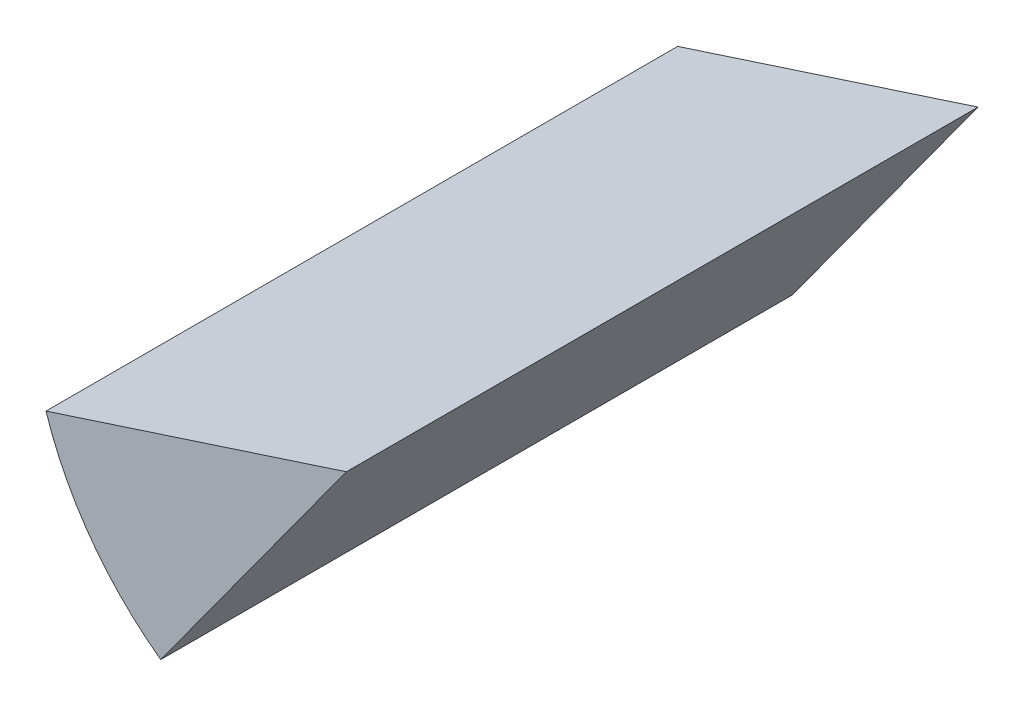
ISO-10303-21;
HEADER;
FILE_DESCRIPTION(('STEP AP214'),'2;1');
FILE_NAME('part.step','',(''),(''),'','','');
FILE_SCHEMA(('AUTOMOTIVE_DESIGN { 1 0 10303 214 1 1 1 1 }'));
ENDSEC;
DATA;
#1=APPLICATION_CONTEXT('core data for automotive mechanical design processes');
#2=APPLICATION_PROTOCOL_DEFINITION('international standard','automotive_design',2000,#1);
#3=PRODUCT_CONTEXT('',#1,'mechanical');
#4=PRODUCT('Part','Part','',(#3));
#5=PRODUCT_RELATED_PRODUCT_CATEGORY('part','',(#4));
#6=PRODUCT_DEFINITION_FORMATION('','',#4);
#7=PRODUCT_DEFINITION_CONTEXT('part definition',#1,'design');
#8=PRODUCT_DEFINITION('design','',#6,#7);
#9=PRODUCT_DEFINITION_SHAPE('','',#8);
#10=(LENGTH_UNIT() NAMED_UNIT(*) SI_UNIT(.MILLI.,.METRE.));
#11=(NAMED_UNIT(*) PLANE_ANGLE_UNIT() SI_UNIT($,.RADIAN.));
#12=(NAMED_UNIT(*) SI_UNIT($,.STERADIAN.) SOLID_ANGLE_UNIT());
#13=UNCERTAINTY_MEASURE_WITH_UNIT(LENGTH_MEASURE(1.E-05),#10,'distance_accuracy_value','');
#14=(GEOMETRIC_REPRESENTATION_CONTEXT(3) GLOBAL_UNCERTAINTY_ASSIGNED_CONTEXT((#13)) GLOBAL_UNIT_ASSIGNED_CONTEXT((#10,
#11,#12)) REPRESENTATION_CONTEXT('',''));
#15=CARTESIAN_POINT('',(0.,0.,0.));
#16=DIRECTION('',(0.,0.,1.));
#17=DIRECTION('',(1.,0.,0.));
#18=AXIS2_PLACEMENT_3D('',#15,#16,#17);
#19=CARTESIAN_POINT('',(0.,0.,50.));
#20=DIRECTION('',(-0.809016994374947,0.587785252292474,0.));
#21=DIRECTION('',(-0.587785252292474,-0.809016994374947,0.));
#22=AXIS2_PLACEMENT_3D('',#19,#20,#21);
#23=PLANE('',#22);
#24=DIRECTION('',(0.587785252292474,0.809016994374947,0.));
#25=VECTOR('',#24,1.);
#26=CARTESIAN_POINT('',(0.,0.,0.));
#27=LINE('',#26,#25);
#28=CARTESIAN_POINT('',(-14.6946313073119,-20.2254248593737,0.));
#29=VERTEX_POINT('',#28);
#30=CARTESIAN_POINT('',(0.,0.,0.));
#31=VERTEX_POINT('',#30);
#32=EDGE_CURVE('E80',#29,#31,#27,.T.);
#33=ORIENTED_EDGE('',*,*,#32,.T.);
#34=DIRECTION('',(0.,0.,-1.));
#35=VECTOR('',#34,1.);
#36=CARTESIAN_POINT('',(0.,0.,50.));
#37=LINE('',#36,#35);
#38=CARTESIAN_POINT('',(0.,0.,50.));
#39=VERTEX_POINT('',#38);
#40=EDGE_CURVE('E11',#39,#31,#37,.T.);
#41=ORIENTED_EDGE('',*,*,#40,.F.);
#42=DIRECTION('',(0.587785252292474,0.809016994374947,0.));
#43=VECTOR('',#42,1.);
#44=CARTESIAN_POINT('',(0.,0.,50.));
#45=LINE('',#44,#43);
#46=CARTESIAN_POINT('',(-14.6946313073119,-20.2254248593737,50.));
#47=VERTEX_POINT('',#46);
#48=EDGE_CURVE('E73',#47,#39,#45,.T.);
#49=ORIENTED_EDGE('',*,*,#48,.F.);
#50=DIRECTION('',(0.,0.,-1.));
#51=VECTOR('',#50,1.);
#52=CARTESIAN_POINT('',(-14.6946313073119,-20.2254248593737,50.));
#53=LINE('',#52,#51);
#54=EDGE_CURVE('E81',#47,#29,#53,.T.);
#55=ORIENTED_EDGE('',*,*,#54,.T.);
#56=EDGE_LOOP('',(#33,#41,#49,#55));
#57=FACE_BOUND('',#56,.T.);
#58=ADVANCED_FACE('F33',(#57),#23,.F.);
#59=CARTESIAN_POINT('',(0.,0.,50.));
#60=DIRECTION('',(0.309016994374945,-0.951056516295154,0.));
#61=DIRECTION('',(0.951056516295154,0.309016994374945,0.));
#62=AXIS2_PLACEMENT_3D('',#59,#60,#61);
#63=PLANE('',#62);
#64=DIRECTION('',(-0.951056516295154,-0.309016994374945,0.));
#65=VECTOR('',#64,1.);
#66=CARTESIAN_POINT('',(0.,0.,0.));
#67=LINE('',#66,#65);
#68=CARTESIAN_POINT('',(-23.7764129073789,-7.72542485937362,0.));
#69=VERTEX_POINT('',#68);
#70=EDGE_CURVE('E61',#31,#69,#67,.T.);
#71=ORIENTED_EDGE('',*,*,#70,.T.);
#72=DIRECTION('',(0.,0.,-1.));
#73=VECTOR('',#72,1.);
#74=CARTESIAN_POINT('',(-23.7764129073789,-7.72542485937362,50.));
#75=LINE('',#74,#73);
#76=CARTESIAN_POINT('',(-23.7764129073789,-7.72542485937362,50.));
#77=VERTEX_POINT('',#76);
#78=EDGE_CURVE('E41',#77,#69,#75,.T.);
#79=ORIENTED_EDGE('',*,*,#78,.F.);
#80=DIRECTION('',(-0.951056516295154,-0.309016994374945,0.));
#81=VECTOR('',#80,1.);
#82=CARTESIAN_POINT('',(0.,0.,50.));
#83=LINE('',#82,#81);
#84=EDGE_CURVE('E69',#39,#77,#83,.T.);
#85=ORIENTED_EDGE('',*,*,#84,.F.);
#86=ORIENTED_EDGE('',*,*,#40,.T.);
#87=EDGE_LOOP('',(#71,#79,#85,#86));
#88=FACE_BOUND('',#87,.T.);
#89=ADVANCED_FACE('F70',(#88),#63,.F.);
#90=CARTESIAN_POINT('',(0.,0.,50.));
#91=DIRECTION('',(0.,0.,-1.));
#92=DIRECTION('',(-1.,0.,0.));
#93=AXIS2_PLACEMENT_3D('',#90,#91,#92);
#94=CYLINDRICAL_SURFACE('',#93,25.);
#95=CARTESIAN_POINT('',(0.,0.,0.));
#96=DIRECTION('',(0.,0.,1.));
#97=DIRECTION('',(1.,0.,0.));
#98=AXIS2_PLACEMENT_3D('',#95,#96,#97);
#99=CIRCLE('',#98,25.);
#100=EDGE_CURVE('E66',#69,#29,#99,.T.);
#101=ORIENTED_EDGE('',*,*,#100,.T.);
#102=ORIENTED_EDGE('',*,*,#54,.F.);
#103=CARTESIAN_POINT('',(0.,0.,50.));
#104=DIRECTION('',(0.,0.,1.));
#105=DIRECTION('',(1.,0.,0.));
#106=AXIS2_PLACEMENT_3D('',#103,#104,#105);
#107=CIRCLE('',#106,25.);
#108=EDGE_CURVE('E49',#77,#47,#107,.T.);
#109=ORIENTED_EDGE('',*,*,#108,.F.);
#110=ORIENTED_EDGE('',*,*,#78,.T.);
#111=EDGE_LOOP('',(#101,#102,#109,#110));
#112=FACE_BOUND('',#111,.T.);
#113=ADVANCED_FACE('F92',(#112),#94,.T.);
#114=CARTESIAN_POINT('',(0.,0.,50.));
#115=DIRECTION('',(0.,0.,1.));
#116=DIRECTION('',(1.,0.,0.));
#117=AXIS2_PLACEMENT_3D('',#114,#115,#116);
#118=PLANE('',#117);
#119=ORIENTED_EDGE('',*,*,#48,.T.);
#120=ORIENTED_EDGE('',*,*,#84,.T.);
#121=ORIENTED_EDGE('',*,*,#108,.T.);
#122=EDGE_LOOP('',(#119,#120,#121));
#123=FACE_BOUND('',#122,.T.);
#124=ADVANCED_FACE('F76',(#123),#118,.T.);
#125=CARTESIAN_POINT('',(0.,0.,0.));
#126=DIRECTION('',(0.,0.,1.));
#127=DIRECTION('',(1.,0.,0.));
#128=AXIS2_PLACEMENT_3D('',#125,#126,#127);
#129=PLANE('',#128);
#130=CARTESIAN_POINT('',(-15.3350635943183,-10.8051614088308,0.));
#131=DIRECTION('',(0.,0.,-1.));
#132=DIRECTION('',(-1.,0.,0.));
#133=AXIS2_PLACEMENT_3D('',#130,#131,#132);
#134=CIRCLE('',#133,5.);
#135=CARTESIAN_POINT('',(-20.3350635943183,-10.8051614088308,0.));
#136=VERTEX_POINT('',#135);
#137=EDGE_CURVE('E87',#136,#136,#134,.T.);
#138=ORIENTED_EDGE('',*,*,#137,.F.);
#139=EDGE_LOOP('',(#138));
#140=FACE_BOUND('',#139,.T.);
#141=ORIENTED_EDGE('',*,*,#32,.F.);
#142=ORIENTED_EDGE('',*,*,#100,.F.);
#143=ORIENTED_EDGE('',*,*,#70,.F.);
#144=EDGE_LOOP('',(#141,#142,#143));
#145=FACE_BOUND('',#144,.T.);
#146=ADVANCED_FACE('F93',(#140,#145),#129,.F.);
#147=CARTESIAN_POINT('',(-15.3350635943183,-10.8051614088308,10.));
#148=DIRECTION('',(0.,0.,-1.));
#149=DIRECTION('',(-1.,0.,0.));
#150=AXIS2_PLACEMENT_3D('',#147,#148,#149);
#151=CYLINDRICAL_SURFACE('',#150,5.);
#152=CARTESIAN_POINT('',(-15.3350635943183,-10.8051614088308,10.));
#153=DIRECTION('',(0.,0.,-1.));
#154=DIRECTION('',(-1.,0.,0.));
#155=AXIS2_PLACEMENT_3D('',#152,#153,#154);
#156=CIRCLE('',#155,5.);
#157=CARTESIAN_POINT('',(-20.3350635943183,-10.8051614088308,10.));
#158=VERTEX_POINT('',#157);
#159=EDGE_CURVE('E83',#158,#158,#156,.T.);
#160=ORIENTED_EDGE('',*,*,#159,.F.);
#161=EDGE_LOOP('',(#160));
#162=FACE_BOUND('',#161,.T.);
#163=ORIENTED_EDGE('',*,*,#137,.T.);
#164=EDGE_LOOP('',(#163));
#165=FACE_BOUND('',#164,.T.);
#166=ADVANCED_FACE('F95',(#162,#165),#151,.F.);
#167=CARTESIAN_POINT('',(-15.3350635943183,-10.8051614088308,10.));
#168=DIRECTION('',(0.,0.,-1.));
#169=DIRECTION('',(-1.,0.,0.));
#170=AXIS2_PLACEMENT_3D('',#167,#168,#169);
#171=PLANE('',#170);
#172=ORIENTED_EDGE('',*,*,#159,.T.);
#173=EDGE_LOOP('',(#172));
#174=FACE_BOUND('',#173,.T.);
#175=ADVANCED_FACE('F102',(#174),#171,.T.);
#176=CLOSED_SHELL('',(#58,#89,#113,#124,#146,#166,#175));
#177=MANIFOLD_SOLID_BREP('B2',#176);
#178=ADVANCED_BREP_SHAPE_REPRESENTATION('',(#18,#177),#14);
#179=SHAPE_DEFINITION_REPRESENTATION(#9,#178);
ENDSEC;
END-ISO-10303-21;
